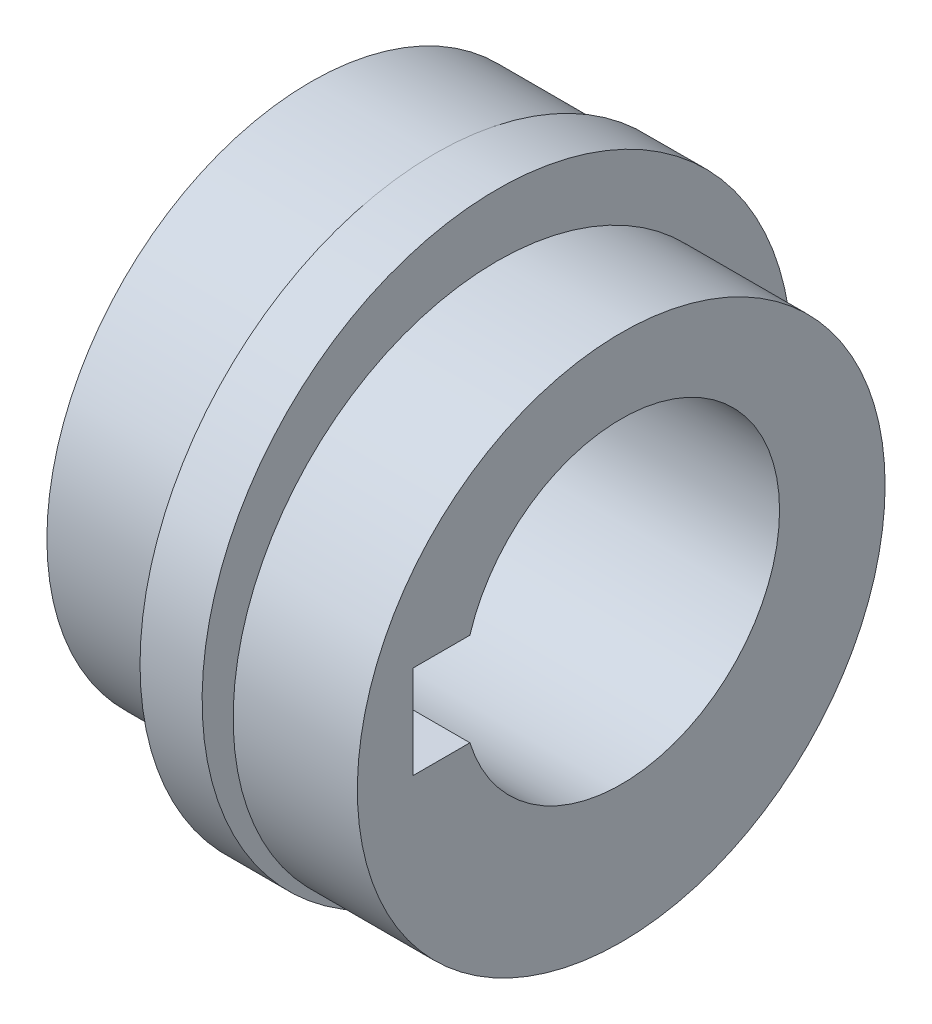
ISO-10303-21;
HEADER;
FILE_DESCRIPTION(('STEP AP214'),'2;1');
FILE_NAME('part.step','',(''),(''),'','','');
FILE_SCHEMA(('AUTOMOTIVE_DESIGN { 1 0 10303 214 1 1 1 1 }'));
ENDSEC;
DATA;
#1=APPLICATION_CONTEXT('core data for automotive mechanical design processes');
#2=APPLICATION_PROTOCOL_DEFINITION('international standard','automotive_design',2000,#1);
#3=PRODUCT_CONTEXT('',#1,'mechanical');
#4=PRODUCT('Part','Part','',(#3));
#5=PRODUCT_RELATED_PRODUCT_CATEGORY('part','',(#4));
#6=PRODUCT_DEFINITION_FORMATION('','',#4);
#7=PRODUCT_DEFINITION_CONTEXT('part definition',#1,'design');
#8=PRODUCT_DEFINITION('design','',#6,#7);
#9=PRODUCT_DEFINITION_SHAPE('','',#8);
#10=(LENGTH_UNIT() NAMED_UNIT(*) SI_UNIT(.MILLI.,.METRE.));
#11=(NAMED_UNIT(*) PLANE_ANGLE_UNIT() SI_UNIT($,.RADIAN.));
#12=(NAMED_UNIT(*) SI_UNIT($,.STERADIAN.) SOLID_ANGLE_UNIT());
#13=UNCERTAINTY_MEASURE_WITH_UNIT(LENGTH_MEASURE(1.E-05),#10,'distance_accuracy_value','');
#14=(GEOMETRIC_REPRESENTATION_CONTEXT(3) GLOBAL_UNCERTAINTY_ASSIGNED_CONTEXT((#13)) GLOBAL_UNIT_ASSIGNED_CONTEXT((#10,
#11,#12)) REPRESENTATION_CONTEXT('',''));
#15=CARTESIAN_POINT('',(0.,0.,0.));
#16=DIRECTION('',(0.,0.,1.));
#17=DIRECTION('',(1.,0.,0.));
#18=AXIS2_PLACEMENT_3D('',#15,#16,#17);
#19=CARTESIAN_POINT('',(5.,-1.,0.));
#20=DIRECTION('',(1.,0.,0.));
#21=DIRECTION('',(0.,0.,-1.));
#22=AXIS2_PLACEMENT_3D('',#19,#20,#21);
#23=PLANE('',#22);
#24=CARTESIAN_POINT('',(5.,-1.,0.));
#25=DIRECTION('',(1.,0.,0.));
#26=DIRECTION('',(0.,0.,-1.));
#27=AXIS2_PLACEMENT_3D('',#24,#25,#26);
#28=CIRCLE('',#27,8.5);
#29=CARTESIAN_POINT('',(5.,-1.,-8.5));
#30=VERTEX_POINT('',#29);
#31=EDGE_CURVE('E149',#30,#30,#28,.T.);
#32=ORIENTED_EDGE('',*,*,#31,.T.);
#33=EDGE_LOOP('',(#32));
#34=FACE_BOUND('',#33,.T.);
#35=CARTESIAN_POINT('',(5.,0.,0.));
#36=DIRECTION('',(1.,0.,0.));
#37=DIRECTION('',(0.,0.,-1.));
#38=AXIS2_PLACEMENT_3D('',#35,#36,#37);
#39=CIRCLE('',#38,5.1);
#40=CARTESIAN_POINT('',(5.,-1.5,4.87442304278158));
#41=VERTEX_POINT('',#40);
#42=CARTESIAN_POINT('',(5.,1.5,4.87442304278157));
#43=VERTEX_POINT('',#42);
#44=EDGE_CURVE('E103',#41,#43,#39,.T.);
#45=ORIENTED_EDGE('',*,*,#44,.F.);
#46=DIRECTION('',(0.,0.,1.));
#47=VECTOR('',#46,1.);
#48=CARTESIAN_POINT('',(5.,-1.5,4.87442304278158));
#49=LINE('',#48,#47);
#50=CARTESIAN_POINT('',(5.,-1.5,6.7));
#51=VERTEX_POINT('',#50);
#52=EDGE_CURVE('E63',#41,#51,#49,.T.);
#53=ORIENTED_EDGE('',*,*,#52,.T.);
#54=DIRECTION('',(0.,1.,0.));
#55=VECTOR('',#54,1.);
#56=CARTESIAN_POINT('',(5.,-1.5,6.7));
#57=LINE('',#56,#55);
#58=CARTESIAN_POINT('',(5.,1.5,6.7));
#59=VERTEX_POINT('',#58);
#60=EDGE_CURVE('E108',#51,#59,#57,.T.);
#61=ORIENTED_EDGE('',*,*,#60,.T.);
#62=DIRECTION('',(0.,0.,-1.));
#63=VECTOR('',#62,1.);
#64=CARTESIAN_POINT('',(5.,1.5,6.7));
#65=LINE('',#64,#63);
#66=EDGE_CURVE('E129',#59,#43,#65,.T.);
#67=ORIENTED_EDGE('',*,*,#66,.T.);
#68=EDGE_LOOP('',(#45,#53,#61,#67));
#69=FACE_BOUND('',#68,.T.);
#70=ADVANCED_FACE('F44',(#34,#69),#23,.T.);
#71=CARTESIAN_POINT('',(-5.,1.,0.));
#72=DIRECTION('',(-1.,0.,0.));
#73=DIRECTION('',(0.,0.,1.));
#74=AXIS2_PLACEMENT_3D('',#71,#72,#73);
#75=PLANE('',#74);
#76=CARTESIAN_POINT('',(-5.,1.,0.));
#77=DIRECTION('',(-1.,0.,0.));
#78=DIRECTION('',(0.,0.,1.));
#79=AXIS2_PLACEMENT_3D('',#76,#77,#78);
#80=CIRCLE('',#79,8.5);
#81=CARTESIAN_POINT('',(-5.,1.,8.5));
#82=VERTEX_POINT('',#81);
#83=EDGE_CURVE('E143',#82,#82,#80,.T.);
#84=ORIENTED_EDGE('',*,*,#83,.T.);
#85=EDGE_LOOP('',(#84));
#86=FACE_BOUND('',#85,.T.);
#87=DIRECTION('',(0.,1.,0.));
#88=VECTOR('',#87,1.);
#89=CARTESIAN_POINT('',(-5.,-1.5,6.7));
#90=LINE('',#89,#88);
#91=CARTESIAN_POINT('',(-5.,-1.5,6.7));
#92=VERTEX_POINT('',#91);
#93=CARTESIAN_POINT('',(-5.,1.5,6.7));
#94=VERTEX_POINT('',#93);
#95=EDGE_CURVE('E105',#92,#94,#90,.T.);
#96=ORIENTED_EDGE('',*,*,#95,.F.);
#97=DIRECTION('',(0.,0.,1.));
#98=VECTOR('',#97,1.);
#99=CARTESIAN_POINT('',(-5.,-1.5,4.87442304278158));
#100=LINE('',#99,#98);
#101=CARTESIAN_POINT('',(-5.,-1.5,4.87442304278158));
#102=VERTEX_POINT('',#101);
#103=EDGE_CURVE('E91',#102,#92,#100,.T.);
#104=ORIENTED_EDGE('',*,*,#103,.F.);
#105=CARTESIAN_POINT('',(-5.,0.,0.));
#106=DIRECTION('',(1.,0.,0.));
#107=DIRECTION('',(0.,0.,-1.));
#108=AXIS2_PLACEMENT_3D('',#105,#106,#107);
#109=CIRCLE('',#108,5.1);
#110=CARTESIAN_POINT('',(-5.,1.5,4.87442304278158));
#111=VERTEX_POINT('',#110);
#112=EDGE_CURVE('E116',#102,#111,#109,.T.);
#113=ORIENTED_EDGE('',*,*,#112,.T.);
#114=DIRECTION('',(0.,0.,-1.));
#115=VECTOR('',#114,1.);
#116=CARTESIAN_POINT('',(-5.,1.5,6.7));
#117=LINE('',#116,#115);
#118=EDGE_CURVE('E118',#94,#111,#117,.T.);
#119=ORIENTED_EDGE('',*,*,#118,.F.);
#120=EDGE_LOOP('',(#96,#104,#113,#119));
#121=FACE_BOUND('',#120,.T.);
#122=ADVANCED_FACE('F113',(#86,#121),#75,.T.);
#123=CARTESIAN_POINT('',(1.,0.,0.));
#124=DIRECTION('',(-1.,0.,0.));
#125=DIRECTION('',(0.,0.,1.));
#126=AXIS2_PLACEMENT_3D('',#123,#124,#125);
#127=CYLINDRICAL_SURFACE('',#126,9.5);
#128=CARTESIAN_POINT('',(1.,0.,0.));
#129=DIRECTION('',(1.,0.,0.));
#130=DIRECTION('',(0.,0.,-1.));
#131=AXIS2_PLACEMENT_3D('',#128,#129,#130);
#132=CIRCLE('',#131,9.5);
#133=CARTESIAN_POINT('',(1.,-9.5,0.));
#134=VERTEX_POINT('',#133);
#135=EDGE_CURVE('E11',#134,#134,#132,.T.);
#136=ORIENTED_EDGE('',*,*,#135,.F.);
#137=EDGE_LOOP('',(#136));
#138=FACE_BOUND('',#137,.T.);
#139=CARTESIAN_POINT('',(-1.,0.,0.));
#140=DIRECTION('',(1.,0.,0.));
#141=DIRECTION('',(0.,0.,-1.));
#142=AXIS2_PLACEMENT_3D('',#139,#140,#141);
#143=CIRCLE('',#142,9.5);
#144=CARTESIAN_POINT('',(-1.,9.5,0.));
#145=VERTEX_POINT('',#144);
#146=EDGE_CURVE('E47',#145,#145,#143,.T.);
#147=ORIENTED_EDGE('',*,*,#146,.T.);
#148=EDGE_LOOP('',(#147));
#149=FACE_BOUND('',#148,.T.);
#150=ADVANCED_FACE('F50',(#138,#149),#127,.T.);
#151=CARTESIAN_POINT('',(1.,0.,0.));
#152=DIRECTION('',(1.,0.,0.));
#153=DIRECTION('',(0.,0.,-1.));
#154=AXIS2_PLACEMENT_3D('',#151,#152,#153);
#155=PLANE('',#154);
#156=ORIENTED_EDGE('',*,*,#135,.T.);
#157=CARTESIAN_POINT('',(1.,-1.,0.));
#158=DIRECTION('',(1.,0.,0.));
#159=DIRECTION('',(0.,0.,-1.));
#160=AXIS2_PLACEMENT_3D('',#157,#158,#159);
#161=CIRCLE('',#160,8.5);
#162=EDGE_CURVE('E144',#134,#134,#161,.T.);
#163=ORIENTED_EDGE('',*,*,#162,.F.);
#164=EDGE_LOOP('',(#156,#163));
#165=FACE_BOUND('',#164,.T.);
#166=ADVANCED_FACE('F157',(#165),#155,.T.);
#167=CARTESIAN_POINT('',(-1.,0.,0.));
#168=DIRECTION('',(1.,0.,0.));
#169=DIRECTION('',(0.,0.,-1.));
#170=AXIS2_PLACEMENT_3D('',#167,#168,#169);
#171=PLANE('',#170);
#172=ORIENTED_EDGE('',*,*,#146,.F.);
#173=CARTESIAN_POINT('',(-1.,1.,0.));
#174=DIRECTION('',(-1.,0.,0.));
#175=DIRECTION('',(0.,0.,1.));
#176=AXIS2_PLACEMENT_3D('',#173,#174,#175);
#177=CIRCLE('',#176,8.5);
#178=EDGE_CURVE('E112',#145,#145,#177,.T.);
#179=ORIENTED_EDGE('',*,*,#178,.F.);
#180=EDGE_LOOP('',(#172,#179));
#181=FACE_BOUND('',#180,.T.);
#182=ADVANCED_FACE('F170',(#181),#171,.F.);
#183=CARTESIAN_POINT('',(5.,-1.,0.));
#184=DIRECTION('',(-1.,0.,0.));
#185=DIRECTION('',(0.,0.,1.));
#186=AXIS2_PLACEMENT_3D('',#183,#184,#185);
#187=CYLINDRICAL_SURFACE('',#186,8.5);
#188=ORIENTED_EDGE('',*,*,#31,.F.);
#189=EDGE_LOOP('',(#188));
#190=FACE_BOUND('',#189,.T.);
#191=ORIENTED_EDGE('',*,*,#162,.T.);
#192=EDGE_LOOP('',(#191));
#193=FACE_BOUND('',#192,.T.);
#194=ADVANCED_FACE('F160',(#190,#193),#187,.T.);
#195=CARTESIAN_POINT('',(-5.,1.,0.));
#196=DIRECTION('',(1.,0.,0.));
#197=DIRECTION('',(0.,0.,-1.));
#198=AXIS2_PLACEMENT_3D('',#195,#196,#197);
#199=CYLINDRICAL_SURFACE('',#198,8.5);
#200=ORIENTED_EDGE('',*,*,#83,.F.);
#201=EDGE_LOOP('',(#200));
#202=FACE_BOUND('',#201,.T.);
#203=ORIENTED_EDGE('',*,*,#178,.T.);
#204=EDGE_LOOP('',(#203));
#205=FACE_BOUND('',#204,.T.);
#206=ADVANCED_FACE('F166',(#202,#205),#199,.T.);
#207=CARTESIAN_POINT('',(-5.,-1.5,4.87442304278158));
#208=DIRECTION('',(0.,1.,0.));
#209=DIRECTION('',(0.,0.,1.));
#210=AXIS2_PLACEMENT_3D('',#207,#208,#209);
#211=PLANE('',#210);
#212=ORIENTED_EDGE('',*,*,#52,.F.);
#213=DIRECTION('',(1.,0.,0.));
#214=VECTOR('',#213,1.);
#215=CARTESIAN_POINT('',(-5.,-1.5,4.87442304278158));
#216=LINE('',#215,#214);
#217=EDGE_CURVE('E100',#102,#41,#216,.T.);
#218=ORIENTED_EDGE('',*,*,#217,.F.);
#219=ORIENTED_EDGE('',*,*,#103,.T.);
#220=DIRECTION('',(1.,0.,0.));
#221=VECTOR('',#220,1.);
#222=CARTESIAN_POINT('',(-5.,-1.5,6.7));
#223=LINE('',#222,#221);
#224=EDGE_CURVE('E96',#92,#51,#223,.T.);
#225=ORIENTED_EDGE('',*,*,#224,.T.);
#226=EDGE_LOOP('',(#212,#218,#219,#225));
#227=FACE_BOUND('',#226,.T.);
#228=ADVANCED_FACE('F92',(#227),#211,.T.);
#229=CARTESIAN_POINT('',(-5.,-1.5,6.7));
#230=DIRECTION('',(0.,0.,-1.));
#231=DIRECTION('',(-1.,0.,0.));
#232=AXIS2_PLACEMENT_3D('',#229,#230,#231);
#233=PLANE('',#232);
#234=ORIENTED_EDGE('',*,*,#60,.F.);
#235=ORIENTED_EDGE('',*,*,#224,.F.);
#236=ORIENTED_EDGE('',*,*,#95,.T.);
#237=DIRECTION('',(1.,0.,0.));
#238=VECTOR('',#237,1.);
#239=CARTESIAN_POINT('',(-5.,1.5,6.7));
#240=LINE('',#239,#238);
#241=EDGE_CURVE('E115',#94,#59,#240,.T.);
#242=ORIENTED_EDGE('',*,*,#241,.T.);
#243=EDGE_LOOP('',(#234,#235,#236,#242));
#244=FACE_BOUND('',#243,.T.);
#245=ADVANCED_FACE('F106',(#244),#233,.T.);
#246=CARTESIAN_POINT('',(-5.,1.5,6.7));
#247=DIRECTION('',(0.,-1.,0.));
#248=DIRECTION('',(0.,0.,-1.));
#249=AXIS2_PLACEMENT_3D('',#246,#247,#248);
#250=PLANE('',#249);
#251=ORIENTED_EDGE('',*,*,#66,.F.);
#252=ORIENTED_EDGE('',*,*,#241,.F.);
#253=ORIENTED_EDGE('',*,*,#118,.T.);
#254=DIRECTION('',(1.,0.,0.));
#255=VECTOR('',#254,1.);
#256=CARTESIAN_POINT('',(-5.,1.5,4.87442304278157));
#257=LINE('',#256,#255);
#258=EDGE_CURVE('E67',#111,#43,#257,.T.);
#259=ORIENTED_EDGE('',*,*,#258,.T.);
#260=EDGE_LOOP('',(#251,#252,#253,#259));
#261=FACE_BOUND('',#260,.T.);
#262=ADVANCED_FACE('F243',(#261),#250,.T.);
#263=CARTESIAN_POINT('',(-5.,0.,0.));
#264=DIRECTION('',(1.,0.,0.));
#265=DIRECTION('',(0.,0.,-1.));
#266=AXIS2_PLACEMENT_3D('',#263,#264,#265);
#267=CYLINDRICAL_SURFACE('',#266,5.1);
#268=ORIENTED_EDGE('',*,*,#44,.T.);
#269=ORIENTED_EDGE('',*,*,#258,.F.);
#270=ORIENTED_EDGE('',*,*,#112,.F.);
#271=ORIENTED_EDGE('',*,*,#217,.T.);
#272=EDGE_LOOP('',(#268,#269,#270,#271));
#273=FACE_BOUND('',#272,.T.);
#274=ADVANCED_FACE('F247',(#273),#267,.F.);
#275=CLOSED_SHELL('',(#70,#122,#150,#166,#182,#194,#206,#228,#245,#262,#274));
#276=MANIFOLD_SOLID_BREP('B2',#275);
#277=ADVANCED_BREP_SHAPE_REPRESENTATION('',(#18,#276),#14);
#278=SHAPE_DEFINITION_REPRESENTATION(#9,#277);
ENDSEC;
END-ISO-10303-21;
